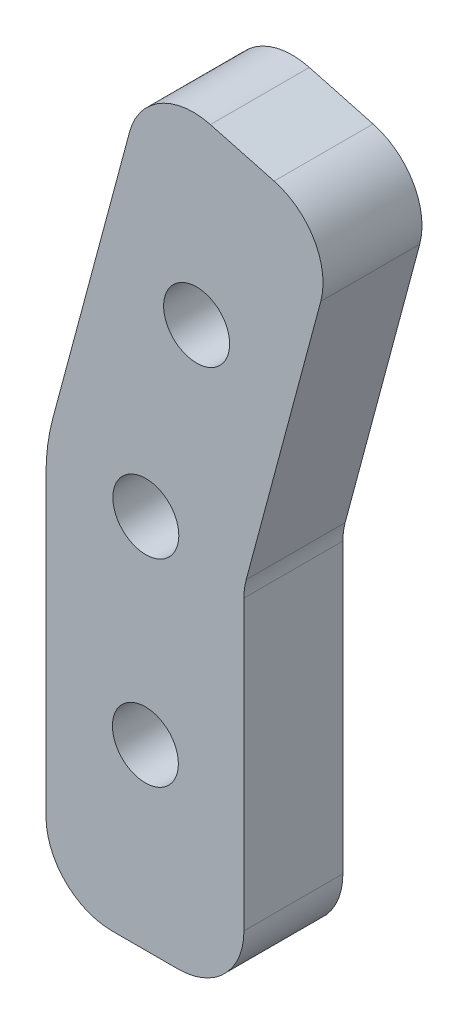
ISO-10303-21;
HEADER;
FILE_DESCRIPTION(('STEP AP214'),'2;1');
FILE_NAME('part.step','',(''),(''),'','','');
FILE_SCHEMA(('AUTOMOTIVE_DESIGN { 1 0 10303 214 1 1 1 1 }'));
ENDSEC;
DATA;
#1=APPLICATION_CONTEXT('core data for automotive mechanical design processes');
#2=APPLICATION_PROTOCOL_DEFINITION('international standard','automotive_design',2000,#1);
#3=PRODUCT_CONTEXT('',#1,'mechanical');
#4=PRODUCT('Part','Part','',(#3));
#5=PRODUCT_RELATED_PRODUCT_CATEGORY('part','',(#4));
#6=PRODUCT_DEFINITION_FORMATION('','',#4);
#7=PRODUCT_DEFINITION_CONTEXT('part definition',#1,'design');
#8=PRODUCT_DEFINITION('design','',#6,#7);
#9=PRODUCT_DEFINITION_SHAPE('','',#8);
#10=(LENGTH_UNIT() NAMED_UNIT(*) SI_UNIT(.MILLI.,.METRE.));
#11=(NAMED_UNIT(*) PLANE_ANGLE_UNIT() SI_UNIT($,.RADIAN.));
#12=(NAMED_UNIT(*) SI_UNIT($,.STERADIAN.) SOLID_ANGLE_UNIT());
#13=UNCERTAINTY_MEASURE_WITH_UNIT(LENGTH_MEASURE(1.E-05),#10,'distance_accuracy_value','');
#14=(GEOMETRIC_REPRESENTATION_CONTEXT(3) GLOBAL_UNCERTAINTY_ASSIGNED_CONTEXT((#13)) GLOBAL_UNIT_ASSIGNED_CONTEXT((#10,
#11,#12)) REPRESENTATION_CONTEXT('',''));
#15=CARTESIAN_POINT('',(0.,0.,0.));
#16=DIRECTION('',(0.,0.,1.));
#17=DIRECTION('',(1.,0.,0.));
#18=AXIS2_PLACEMENT_3D('',#15,#16,#17);
#19=CARTESIAN_POINT('',(9.525,-17.4625,4.7625));
#20=DIRECTION('',(-1.,0.,0.));
#21=DIRECTION('',(0.,0.,1.));
#22=AXIS2_PLACEMENT_3D('',#19,#20,#21);
#23=PLANE('',#22);
#24=DIRECTION('',(0.,1.,0.));
#25=VECTOR('',#24,1.);
#26=CARTESIAN_POINT('',(9.525,-17.4625,-4.7625));
#27=LINE('',#26,#25);
#28=CARTESIAN_POINT('',(9.525,-11.1125,-4.7625));
#29=VERTEX_POINT('',#28);
#30=CARTESIAN_POINT('',(9.525,16.62650664032,-4.7625));
#31=VERTEX_POINT('',#30);
#32=EDGE_CURVE('E142',#29,#31,#27,.T.);
#33=ORIENTED_EDGE('',*,*,#32,.T.);
#34=DIRECTION('',(0.,0.,-1.));
#35=VECTOR('',#34,1.);
#36=CARTESIAN_POINT('',(9.525,16.62650664032,4.7625));
#37=LINE('',#36,#35);
#38=CARTESIAN_POINT('',(9.525,16.62650664032,4.7625));
#39=VERTEX_POINT('',#38);
#40=EDGE_CURVE('E174',#31,#39,#37,.F.);
#41=ORIENTED_EDGE('',*,*,#40,.T.);
#42=DIRECTION('',(0.,1.,0.));
#43=VECTOR('',#42,1.);
#44=CARTESIAN_POINT('',(9.525,-17.4625,4.7625));
#45=LINE('',#44,#43);
#46=CARTESIAN_POINT('',(9.525,-11.1125,4.7625));
#47=VERTEX_POINT('',#46);
#48=EDGE_CURVE('E149',#47,#39,#45,.T.);
#49=ORIENTED_EDGE('',*,*,#48,.F.);
#50=DIRECTION('',(0.,0.,-1.));
#51=VECTOR('',#50,1.);
#52=CARTESIAN_POINT('',(9.525,-11.1125,4.7625));
#53=LINE('',#52,#51);
#54=EDGE_CURVE('E171',#47,#29,#53,.T.);
#55=ORIENTED_EDGE('',*,*,#54,.T.);
#56=EDGE_LOOP('',(#33,#41,#49,#55));
#57=FACE_BOUND('',#56,.T.);
#58=ADVANCED_FACE('F35',(#57),#23,.F.);
#59=CARTESIAN_POINT('',(-9.525,-17.4625,4.7625));
#60=DIRECTION('',(1.,0.,0.));
#61=DIRECTION('',(0.,0.,-1.));
#62=AXIS2_PLACEMENT_3D('',#59,#60,#61);
#63=PLANE('',#62);
#64=DIRECTION('',(0.,-1.,0.));
#65=VECTOR('',#64,1.);
#66=CARTESIAN_POINT('',(-9.525,-17.4625,-4.7625));
#67=LINE('',#66,#65);
#68=CARTESIAN_POINT('',(-9.525,17.4625,-4.7625));
#69=VERTEX_POINT('',#68);
#70=CARTESIAN_POINT('',(-9.525,-11.1125,-4.7625));
#71=VERTEX_POINT('',#70);
#72=EDGE_CURVE('E139',#69,#71,#67,.T.);
#73=ORIENTED_EDGE('',*,*,#72,.T.);
#74=DIRECTION('',(0.,0.,-1.));
#75=VECTOR('',#74,1.);
#76=CARTESIAN_POINT('',(-9.525,-11.1125,4.7625));
#77=LINE('',#76,#75);
#78=CARTESIAN_POINT('',(-9.525,-11.1125,4.7625));
#79=VERTEX_POINT('',#78);
#80=EDGE_CURVE('E201',#71,#79,#77,.F.);
#81=ORIENTED_EDGE('',*,*,#80,.T.);
#82=DIRECTION('',(0.,-1.,0.));
#83=VECTOR('',#82,1.);
#84=CARTESIAN_POINT('',(-9.525,-17.4625,4.7625));
#85=LINE('',#84,#83);
#86=CARTESIAN_POINT('',(-9.525,17.4625,4.7625));
#87=VERTEX_POINT('',#86);
#88=EDGE_CURVE('E152',#87,#79,#85,.T.);
#89=ORIENTED_EDGE('',*,*,#88,.F.);
#90=DIRECTION('',(0.,0.,-1.));
#91=VECTOR('',#90,1.);
#92=CARTESIAN_POINT('',(-9.525,17.4625,4.7625));
#93=LINE('',#92,#91);
#94=EDGE_CURVE('E159',#87,#69,#93,.T.);
#95=ORIENTED_EDGE('',*,*,#94,.T.);
#96=EDGE_LOOP('',(#73,#81,#89,#95));
#97=FACE_BOUND('',#96,.T.);
#98=ADVANCED_FACE('F283',(#97),#63,.F.);
#99=CARTESIAN_POINT('',(-9.525,-17.4625,4.7625));
#100=DIRECTION('',(0.,1.,0.));
#101=DIRECTION('',(0.,0.,1.));
#102=AXIS2_PLACEMENT_3D('',#99,#100,#101);
#103=PLANE('',#102);
#104=DIRECTION('',(1.,0.,0.));
#105=VECTOR('',#104,1.);
#106=CARTESIAN_POINT('',(-9.525,-17.4625,4.7625));
#107=LINE('',#106,#105);
#108=CARTESIAN_POINT('',(-3.175,-17.4625,4.7625));
#109=VERTEX_POINT('',#108);
#110=CARTESIAN_POINT('',(3.175,-17.4625,4.7625));
#111=VERTEX_POINT('',#110);
#112=EDGE_CURVE('E156',#109,#111,#107,.T.);
#113=ORIENTED_EDGE('',*,*,#112,.F.);
#114=DIRECTION('',(0.,0.,-1.));
#115=VECTOR('',#114,1.);
#116=CARTESIAN_POINT('',(-3.175,-17.4625,4.7625));
#117=LINE('',#116,#115);
#118=CARTESIAN_POINT('',(-3.175,-17.4625,-4.7625));
#119=VERTEX_POINT('',#118);
#120=EDGE_CURVE('E198',#109,#119,#117,.T.);
#121=ORIENTED_EDGE('',*,*,#120,.T.);
#122=DIRECTION('',(1.,0.,0.));
#123=VECTOR('',#122,1.);
#124=CARTESIAN_POINT('',(-9.525,-17.4625,-4.7625));
#125=LINE('',#124,#123);
#126=CARTESIAN_POINT('',(3.175,-17.4625,-4.7625));
#127=VERTEX_POINT('',#126);
#128=EDGE_CURVE('E153',#119,#127,#125,.T.);
#129=ORIENTED_EDGE('',*,*,#128,.T.);
#130=DIRECTION('',(0.,0.,-1.));
#131=VECTOR('',#130,1.);
#132=CARTESIAN_POINT('',(3.175,-17.4625,4.7625));
#133=LINE('',#132,#131);
#134=EDGE_CURVE('E196',#127,#111,#133,.F.);
#135=ORIENTED_EDGE('',*,*,#134,.T.);
#136=EDGE_LOOP('',(#113,#121,#129,#135));
#137=FACE_BOUND('',#136,.T.);
#138=ADVANCED_FACE('F263',(#137),#103,.F.);
#139=CARTESIAN_POINT('',(0.,0.,4.7625));
#140=DIRECTION('',(0.,0.,-1.));
#141=DIRECTION('',(-1.,0.,0.));
#142=AXIS2_PLACEMENT_3D('',#139,#140,#141);
#143=PLANE('',#142);
#144=CARTESIAN_POINT('',(0.0814876954144572,18.705761980896,4.7625));
#145=DIRECTION('',(0.,0.,1.));
#146=DIRECTION('',(1.,0.,0.));
#147=AXIS2_PLACEMENT_3D('',#144,#145,#146);
#148=CIRCLE('',#147,3.17499999999999);
#149=CARTESIAN_POINT('',(3.25648769541444,18.705761980896,4.7625));
#150=VERTEX_POINT('',#149);
#151=EDGE_CURVE('E255',#150,#150,#148,.T.);
#152=ORIENTED_EDGE('',*,*,#151,.F.);
#153=EDGE_LOOP('',(#152));
#154=FACE_BOUND('',#153,.T.);
#155=CARTESIAN_POINT('',(4.97052059182165,37.1177107462453,4.7625));
#156=DIRECTION('',(0.,0.,1.));
#157=DIRECTION('',(1.,0.,0.));
#158=AXIS2_PLACEMENT_3D('',#155,#156,#157);
#159=CIRCLE('',#158,3.17499999999999);
#160=CARTESIAN_POINT('',(8.14552059182164,37.1177107462453,4.7625));
#161=VERTEX_POINT('',#160);
#162=EDGE_CURVE('E249',#161,#161,#159,.T.);
#163=ORIENTED_EDGE('',*,*,#162,.F.);
#164=EDGE_LOOP('',(#163));
#165=FACE_BOUND('',#164,.T.);
#166=CARTESIAN_POINT('',(0.0385677287744967,-0.344238019104013,4.7625));
#167=DIRECTION('',(0.,0.,1.));
#168=DIRECTION('',(1.,0.,0.));
#169=AXIS2_PLACEMENT_3D('',#166,#167,#168);
#170=CIRCLE('',#169,3.17499999999999);
#171=CARTESIAN_POINT('',(3.21356772877448,-0.344238019104013,4.7625));
#172=VERTEX_POINT('',#171);
#173=EDGE_CURVE('E228',#172,#172,#170,.T.);
#174=ORIENTED_EDGE('',*,*,#173,.F.);
#175=EDGE_LOOP('',(#174));
#176=FACE_BOUND('',#175,.T.);
#177=DIRECTION('',(-0.965925826289068,0.258819045102521,0.));
#178=VECTOR('',#177,1.);
#179=CARTESIAN_POINT('',(18.5642551502056,51.1974594831457,4.7625));
#180=LINE('',#179,#178);
#181=CARTESIAN_POINT('',(12.43062615327,52.8409604195467,4.7625));
#182=VERTEX_POINT('',#181);
#183=CARTESIAN_POINT('',(6.29699715633439,54.4844613559477,4.7625));
#184=VERTEX_POINT('',#183);
#185=EDGE_CURVE('E222',#182,#184,#180,.T.);
#186=ORIENTED_EDGE('',*,*,#185,.T.);
#187=CARTESIAN_POINT('',(4.65349621993338,48.3508323590121,4.7625));
#188=DIRECTION('',(0.,0.,-1.));
#189=DIRECTION('',(-1.,0.,0.));
#190=AXIS2_PLACEMENT_3D('',#187,#188,#189);
#191=CIRCLE('',#190,6.35);
#192=CARTESIAN_POINT('',(-1.48013277700221,49.9943332954132,4.7625));
#193=VERTEX_POINT('',#192);
#194=EDGE_CURVE('E187',#184,#193,#191,.F.);
#195=ORIENTED_EDGE('',*,*,#194,.T.);
#196=DIRECTION('',(-0.258819045102521,-0.965925826289068,0.));
#197=VECTOR('',#196,1.);
#198=CARTESIAN_POINT('',(0.163368159398802,56.1279622923487,4.7625));
#199=LINE('',#198,#197);
#200=CARTESIAN_POINT('',(-8.87588699080675,22.393002809203,4.7625));
#201=VERTEX_POINT('',#200);
#202=EDGE_CURVE('E225',#193,#201,#199,.T.);
#203=ORIENTED_EDGE('',*,*,#202,.T.);
#204=CARTESIAN_POINT('',(9.525,17.4625,4.7625));
#205=DIRECTION('',(0.,0.,1.));
#206=DIRECTION('',(1.,0.,0.));
#207=AXIS2_PLACEMENT_3D('',#204,#205,#206);
#208=CIRCLE('',#207,19.05);
#209=EDGE_CURVE('E133',#201,#87,#208,.T.);
#210=ORIENTED_EDGE('',*,*,#209,.T.);
#211=ORIENTED_EDGE('',*,*,#88,.T.);
#212=CARTESIAN_POINT('',(-3.175,-11.1125,4.7625));
#213=DIRECTION('',(0.,0.,-1.));
#214=DIRECTION('',(-1.,0.,0.));
#215=AXIS2_PLACEMENT_3D('',#212,#213,#214);
#216=CIRCLE('',#215,6.35);
#217=EDGE_CURVE('E185',#79,#109,#216,.F.);
#218=ORIENTED_EDGE('',*,*,#217,.T.);
#219=ORIENTED_EDGE('',*,*,#112,.T.);
#220=CARTESIAN_POINT('',(3.175,-11.1125,4.7625));
#221=DIRECTION('',(0.,0.,-1.));
#222=DIRECTION('',(-1.,0.,0.));
#223=AXIS2_PLACEMENT_3D('',#220,#221,#222);
#224=CIRCLE('',#223,6.35);
#225=EDGE_CURVE('E183',#111,#47,#224,.F.);
#226=ORIENTED_EDGE('',*,*,#225,.T.);
#227=ORIENTED_EDGE('',*,*,#48,.T.);
#228=CARTESIAN_POINT('',(15.875,16.62650664032,4.7625));
#229=DIRECTION('',(0.,0.,-1.));
#230=DIRECTION('',(-1.,0.,0.));
#231=AXIS2_PLACEMENT_3D('',#228,#229,#230);
#232=CIRCLE('',#231,6.35);
#233=CARTESIAN_POINT('',(9.74137100306442,18.270007576721,4.7625));
#234=VERTEX_POINT('',#233);
#235=EDGE_CURVE('E11',#39,#234,#232,.T.);
#236=ORIENTED_EDGE('',*,*,#235,.T.);
#237=DIRECTION('',(0.258819045102521,0.965925826289068,0.));
#238=VECTOR('',#237,1.);
#239=CARTESIAN_POINT('',(9.525,17.4625,4.7625));
#240=LINE('',#239,#238);
#241=CARTESIAN_POINT('',(16.9207542138045,45.0638304862101,4.7625));
#242=VERTEX_POINT('',#241);
#243=EDGE_CURVE('E218',#234,#242,#240,.T.);
#244=ORIENTED_EDGE('',*,*,#243,.T.);
#245=CARTESIAN_POINT('',(10.787125216869,46.7073314226111,4.7625));
#246=DIRECTION('',(0.,0.,-1.));
#247=DIRECTION('',(-1.,0.,0.));
#248=AXIS2_PLACEMENT_3D('',#245,#246,#247);
#249=CIRCLE('',#248,6.35);
#250=EDGE_CURVE('E181',#242,#182,#249,.F.);
#251=ORIENTED_EDGE('',*,*,#250,.T.);
#252=EDGE_LOOP('',(#186,#195,#203,#210,#211,#218,#219,#226,#227,#236,#244,#251));
#253=FACE_BOUND('',#252,.T.);
#254=ADVANCED_FACE('F217',(#154,#165,#176,#253),#143,.F.);
#255=CARTESIAN_POINT('',(0.,0.,-4.7625));
#256=DIRECTION('',(0.,0.,-1.));
#257=DIRECTION('',(-1.,0.,0.));
#258=AXIS2_PLACEMENT_3D('',#255,#256,#257);
#259=PLANE('',#258);
#260=CARTESIAN_POINT('',(0.0814876954144572,18.705761980896,-4.7625));
#261=DIRECTION('',(0.,0.,1.));
#262=DIRECTION('',(1.,0.,0.));
#263=AXIS2_PLACEMENT_3D('',#260,#261,#262);
#264=CIRCLE('',#263,3.175);
#265=CARTESIAN_POINT('',(3.25648769541445,18.705761980896,-4.7625));
#266=VERTEX_POINT('',#265);
#267=EDGE_CURVE('E252',#266,#266,#264,.T.);
#268=ORIENTED_EDGE('',*,*,#267,.T.);
#269=EDGE_LOOP('',(#268));
#270=FACE_BOUND('',#269,.T.);
#271=CARTESIAN_POINT('',(4.97052059182165,37.1177107462453,-4.7625));
#272=DIRECTION('',(0.,0.,1.));
#273=DIRECTION('',(1.,0.,0.));
#274=AXIS2_PLACEMENT_3D('',#271,#272,#273);
#275=CIRCLE('',#274,3.175);
#276=CARTESIAN_POINT('',(8.14552059182165,37.1177107462453,-4.7625));
#277=VERTEX_POINT('',#276);
#278=EDGE_CURVE('E246',#277,#277,#275,.T.);
#279=ORIENTED_EDGE('',*,*,#278,.T.);
#280=EDGE_LOOP('',(#279));
#281=FACE_BOUND('',#280,.T.);
#282=CARTESIAN_POINT('',(0.0385677287744967,-0.344238019104013,-4.7625));
#283=DIRECTION('',(0.,0.,1.));
#284=DIRECTION('',(1.,0.,0.));
#285=AXIS2_PLACEMENT_3D('',#282,#283,#284);
#286=CIRCLE('',#285,3.175);
#287=CARTESIAN_POINT('',(3.21356772877449,-0.344238019104013,-4.7625));
#288=VERTEX_POINT('',#287);
#289=EDGE_CURVE('E223',#288,#288,#286,.T.);
#290=ORIENTED_EDGE('',*,*,#289,.T.);
#291=EDGE_LOOP('',(#290));
#292=FACE_BOUND('',#291,.T.);
#293=DIRECTION('',(-0.258819045102521,-0.965925826289068,0.));
#294=VECTOR('',#293,1.);
#295=CARTESIAN_POINT('',(0.163368159398802,56.1279622923487,-4.7625));
#296=LINE('',#295,#294);
#297=CARTESIAN_POINT('',(-1.48013277700221,49.9943332954132,-4.7625));
#298=VERTEX_POINT('',#297);
#299=CARTESIAN_POINT('',(-8.87588699080675,22.393002809203,-4.7625));
#300=VERTEX_POINT('',#299);
#301=EDGE_CURVE('E123',#298,#300,#296,.T.);
#302=ORIENTED_EDGE('',*,*,#301,.F.);
#303=CARTESIAN_POINT('',(4.65349621993338,48.3508323590121,-4.7625));
#304=DIRECTION('',(0.,0.,-1.));
#305=DIRECTION('',(-1.,0.,0.));
#306=AXIS2_PLACEMENT_3D('',#303,#304,#305);
#307=CIRCLE('',#306,6.35);
#308=CARTESIAN_POINT('',(6.29699715633438,54.4844613559477,-4.7625));
#309=VERTEX_POINT('',#308);
#310=EDGE_CURVE('E194',#298,#309,#307,.T.);
#311=ORIENTED_EDGE('',*,*,#310,.T.);
#312=DIRECTION('',(-0.965925826289068,0.258819045102521,0.));
#313=VECTOR('',#312,1.);
#314=CARTESIAN_POINT('',(18.5642551502056,51.1974594831457,-4.7625));
#315=LINE('',#314,#313);
#316=CARTESIAN_POINT('',(12.43062615327,52.8409604195467,-4.7625));
#317=VERTEX_POINT('',#316);
#318=EDGE_CURVE('E134',#317,#309,#315,.T.);
#319=ORIENTED_EDGE('',*,*,#318,.F.);
#320=CARTESIAN_POINT('',(10.787125216869,46.7073314226111,-4.7625));
#321=DIRECTION('',(0.,0.,-1.));
#322=DIRECTION('',(-1.,0.,0.));
#323=AXIS2_PLACEMENT_3D('',#320,#321,#322);
#324=CIRCLE('',#323,6.35);
#325=CARTESIAN_POINT('',(16.9207542138045,45.0638304862101,-4.7625));
#326=VERTEX_POINT('',#325);
#327=EDGE_CURVE('E190',#317,#326,#324,.T.);
#328=ORIENTED_EDGE('',*,*,#327,.T.);
#329=DIRECTION('',(0.258819045102521,0.965925826289068,0.));
#330=VECTOR('',#329,1.);
#331=CARTESIAN_POINT('',(9.525,17.4625,-4.7625));
#332=LINE('',#331,#330);
#333=CARTESIAN_POINT('',(9.74137100306442,18.270007576721,-4.7625));
#334=VERTEX_POINT('',#333);
#335=EDGE_CURVE('E204',#334,#326,#332,.T.);
#336=ORIENTED_EDGE('',*,*,#335,.F.);
#337=CARTESIAN_POINT('',(15.875,16.62650664032,-4.7625));
#338=DIRECTION('',(0.,0.,-1.));
#339=DIRECTION('',(-1.,0.,0.));
#340=AXIS2_PLACEMENT_3D('',#337,#338,#339);
#341=CIRCLE('',#340,6.35);
#342=EDGE_CURVE('E43',#334,#31,#341,.F.);
#343=ORIENTED_EDGE('',*,*,#342,.T.);
#344=ORIENTED_EDGE('',*,*,#32,.F.);
#345=CARTESIAN_POINT('',(3.175,-11.1125,-4.7625));
#346=DIRECTION('',(0.,0.,-1.));
#347=DIRECTION('',(-1.,0.,0.));
#348=AXIS2_PLACEMENT_3D('',#345,#346,#347);
#349=CIRCLE('',#348,6.35);
#350=EDGE_CURVE('E56',#29,#127,#349,.T.);
#351=ORIENTED_EDGE('',*,*,#350,.T.);
#352=ORIENTED_EDGE('',*,*,#128,.F.);
#353=CARTESIAN_POINT('',(-3.175,-11.1125,-4.7625));
#354=DIRECTION('',(0.,0.,-1.));
#355=DIRECTION('',(-1.,0.,0.));
#356=AXIS2_PLACEMENT_3D('',#353,#354,#355);
#357=CIRCLE('',#356,6.35);
#358=EDGE_CURVE('E50',#119,#71,#357,.T.);
#359=ORIENTED_EDGE('',*,*,#358,.T.);
#360=ORIENTED_EDGE('',*,*,#72,.F.);
#361=CARTESIAN_POINT('',(9.525,17.4625,-4.7625));
#362=DIRECTION('',(0.,0.,-1.));
#363=DIRECTION('',(-1.,0.,0.));
#364=AXIS2_PLACEMENT_3D('',#361,#362,#363);
#365=CIRCLE('',#364,19.05);
#366=EDGE_CURVE('E137',#300,#69,#365,.F.);
#367=ORIENTED_EDGE('',*,*,#366,.F.);
#368=EDGE_LOOP('',(#302,#311,#319,#328,#336,#343,#344,#351,#352,#359,#360,#367));
#369=FACE_BOUND('',#368,.T.);
#370=ADVANCED_FACE('F138',(#270,#281,#292,#369),#259,.T.);
#371=CARTESIAN_POINT('',(9.525,17.4625,-24.4402122133534));
#372=DIRECTION('',(0.,0.,1.));
#373=DIRECTION('',(1.,0.,0.));
#374=AXIS2_PLACEMENT_3D('',#371,#372,#373);
#375=CYLINDRICAL_SURFACE('',#374,19.05);
#376=DIRECTION('',(0.,0.,1.));
#377=VECTOR('',#376,1.);
#378=CARTESIAN_POINT('',(-8.87588699080675,22.393002809203,-24.4402122133534));
#379=LINE('',#378,#377);
#380=EDGE_CURVE('E128',#300,#201,#379,.T.);
#381=ORIENTED_EDGE('',*,*,#380,.F.);
#382=ORIENTED_EDGE('',*,*,#366,.T.);
#383=ORIENTED_EDGE('',*,*,#94,.F.);
#384=ORIENTED_EDGE('',*,*,#209,.F.);
#385=EDGE_LOOP('',(#381,#382,#383,#384));
#386=FACE_BOUND('',#385,.T.);
#387=ADVANCED_FACE('F144',(#386),#375,.T.);
#388=CARTESIAN_POINT('',(9.525,17.4625,-52.1753608607412));
#389=DIRECTION('',(0.965925826289068,-0.258819045102521,0.));
#390=DIRECTION('',(0.258819045102521,0.965925826289068,0.));
#391=AXIS2_PLACEMENT_3D('',#388,#389,#390);
#392=PLANE('',#391);
#393=ORIENTED_EDGE('',*,*,#243,.F.);
#394=DIRECTION('',(0.,0.,-1.));
#395=VECTOR('',#394,1.);
#396=CARTESIAN_POINT('',(9.74137100306442,18.270007576721,-52.1753608607412));
#397=LINE('',#396,#395);
#398=EDGE_CURVE('E168',#234,#334,#397,.T.);
#399=ORIENTED_EDGE('',*,*,#398,.T.);
#400=ORIENTED_EDGE('',*,*,#335,.T.);
#401=DIRECTION('',(0.,0.,1.));
#402=VECTOR('',#401,1.);
#403=CARTESIAN_POINT('',(16.9207542138045,45.0638304862101,-52.1753608607412));
#404=LINE('',#403,#402);
#405=EDGE_CURVE('E165',#326,#242,#404,.T.);
#406=ORIENTED_EDGE('',*,*,#405,.T.);
#407=EDGE_LOOP('',(#393,#399,#400,#406));
#408=FACE_BOUND('',#407,.T.);
#409=ADVANCED_FACE('F220',(#408),#392,.T.);
#410=CARTESIAN_POINT('',(18.5642551502056,51.1974594831457,-52.1753608607412));
#411=DIRECTION('',(0.258819045102521,0.965925826289068,0.));
#412=DIRECTION('',(-0.965925826289068,0.258819045102521,0.));
#413=AXIS2_PLACEMENT_3D('',#410,#411,#412);
#414=PLANE('',#413);
#415=ORIENTED_EDGE('',*,*,#318,.T.);
#416=DIRECTION('',(0.,0.,1.));
#417=VECTOR('',#416,1.);
#418=CARTESIAN_POINT('',(6.29699715633439,54.4844613559477,-52.1753608607412));
#419=LINE('',#418,#417);
#420=EDGE_CURVE('E178',#309,#184,#419,.T.);
#421=ORIENTED_EDGE('',*,*,#420,.T.);
#422=ORIENTED_EDGE('',*,*,#185,.F.);
#423=DIRECTION('',(0.,0.,1.));
#424=VECTOR('',#423,1.);
#425=CARTESIAN_POINT('',(12.43062615327,52.8409604195467,-52.1753608607412));
#426=LINE('',#425,#424);
#427=EDGE_CURVE('E176',#182,#317,#426,.F.);
#428=ORIENTED_EDGE('',*,*,#427,.T.);
#429=EDGE_LOOP('',(#415,#421,#422,#428));
#430=FACE_BOUND('',#429,.T.);
#431=ADVANCED_FACE('F237',(#430),#414,.T.);
#432=CARTESIAN_POINT('',(0.163368159398802,56.1279622923487,-52.1753608607412));
#433=DIRECTION('',(-0.965925826289068,0.258819045102521,0.));
#434=DIRECTION('',(-0.258819045102521,-0.965925826289068,0.));
#435=AXIS2_PLACEMENT_3D('',#432,#433,#434);
#436=PLANE('',#435);
#437=ORIENTED_EDGE('',*,*,#202,.F.);
#438=DIRECTION('',(0.,0.,1.));
#439=VECTOR('',#438,1.);
#440=CARTESIAN_POINT('',(-1.48013277700221,49.9943332954132,-52.1753608607412));
#441=LINE('',#440,#439);
#442=EDGE_CURVE('E131',#193,#298,#441,.F.);
#443=ORIENTED_EDGE('',*,*,#442,.T.);
#444=ORIENTED_EDGE('',*,*,#301,.T.);
#445=ORIENTED_EDGE('',*,*,#380,.T.);
#446=EDGE_LOOP('',(#437,#443,#444,#445));
#447=FACE_BOUND('',#446,.T.);
#448=ADVANCED_FACE('F126',(#447),#436,.T.);
#449=CARTESIAN_POINT('',(0.0385677287744967,-0.344238019104013,4.7625));
#450=DIRECTION('',(0.,0.,1.));
#451=DIRECTION('',(1.,0.,0.));
#452=AXIS2_PLACEMENT_3D('',#449,#450,#451);
#453=CYLINDRICAL_SURFACE('',#452,3.17499999999999);
#454=ORIENTED_EDGE('',*,*,#289,.F.);
#455=EDGE_LOOP('',(#454));
#456=FACE_BOUND('',#455,.T.);
#457=ORIENTED_EDGE('',*,*,#173,.T.);
#458=EDGE_LOOP('',(#457));
#459=FACE_BOUND('',#458,.T.);
#460=ADVANCED_FACE('F269',(#456,#459),#453,.F.);
#461=CARTESIAN_POINT('',(4.97052059182165,37.1177107462453,4.7625));
#462=DIRECTION('',(0.,0.,1.));
#463=DIRECTION('',(1.,0.,0.));
#464=AXIS2_PLACEMENT_3D('',#461,#462,#463);
#465=CYLINDRICAL_SURFACE('',#464,3.17499999999999);
#466=ORIENTED_EDGE('',*,*,#278,.F.);
#467=EDGE_LOOP('',(#466));
#468=FACE_BOUND('',#467,.T.);
#469=ORIENTED_EDGE('',*,*,#162,.T.);
#470=EDGE_LOOP('',(#469));
#471=FACE_BOUND('',#470,.T.);
#472=ADVANCED_FACE('F271',(#468,#471),#465,.F.);
#473=CARTESIAN_POINT('',(0.0814876954144572,18.705761980896,4.7625));
#474=DIRECTION('',(0.,0.,1.));
#475=DIRECTION('',(1.,0.,0.));
#476=AXIS2_PLACEMENT_3D('',#473,#474,#475);
#477=CYLINDRICAL_SURFACE('',#476,3.17499999999999);
#478=ORIENTED_EDGE('',*,*,#267,.F.);
#479=EDGE_LOOP('',(#478));
#480=FACE_BOUND('',#479,.T.);
#481=ORIENTED_EDGE('',*,*,#151,.T.);
#482=EDGE_LOOP('',(#481));
#483=FACE_BOUND('',#482,.T.);
#484=ADVANCED_FACE('F259',(#480,#483),#477,.F.);
#485=CARTESIAN_POINT('',(15.875,16.62650664032,-52.1753608607412));
#486=DIRECTION('',(0.,0.,-1.));
#487=DIRECTION('',(-1.,0.,0.));
#488=AXIS2_PLACEMENT_3D('',#485,#486,#487);
#489=CYLINDRICAL_SURFACE('',#488,6.35);
#490=ORIENTED_EDGE('',*,*,#235,.F.);
#491=ORIENTED_EDGE('',*,*,#40,.F.);
#492=ORIENTED_EDGE('',*,*,#342,.F.);
#493=ORIENTED_EDGE('',*,*,#398,.F.);
#494=EDGE_LOOP('',(#490,#491,#492,#493));
#495=FACE_BOUND('',#494,.T.);
#496=ADVANCED_FACE('F212',(#495),#489,.F.);
#497=CARTESIAN_POINT('',(4.65349621993338,48.3508323590121,-52.1753608607412));
#498=DIRECTION('',(0.,0.,1.));
#499=DIRECTION('',(1.,0.,0.));
#500=AXIS2_PLACEMENT_3D('',#497,#498,#499);
#501=CYLINDRICAL_SURFACE('',#500,6.35);
#502=ORIENTED_EDGE('',*,*,#310,.F.);
#503=ORIENTED_EDGE('',*,*,#442,.F.);
#504=ORIENTED_EDGE('',*,*,#194,.F.);
#505=ORIENTED_EDGE('',*,*,#420,.F.);
#506=EDGE_LOOP('',(#502,#503,#504,#505));
#507=FACE_BOUND('',#506,.T.);
#508=ADVANCED_FACE('F242',(#507),#501,.T.);
#509=CARTESIAN_POINT('',(-3.175,-11.1125,4.7625));
#510=DIRECTION('',(0.,0.,-1.));
#511=DIRECTION('',(-1.,0.,0.));
#512=AXIS2_PLACEMENT_3D('',#509,#510,#511);
#513=CYLINDRICAL_SURFACE('',#512,6.35);
#514=ORIENTED_EDGE('',*,*,#217,.F.);
#515=ORIENTED_EDGE('',*,*,#80,.F.);
#516=ORIENTED_EDGE('',*,*,#358,.F.);
#517=ORIENTED_EDGE('',*,*,#120,.F.);
#518=EDGE_LOOP('',(#514,#515,#516,#517));
#519=FACE_BOUND('',#518,.T.);
#520=ADVANCED_FACE('F296',(#519),#513,.T.);
#521=CARTESIAN_POINT('',(3.175,-11.1125,4.7625));
#522=DIRECTION('',(0.,0.,-1.));
#523=DIRECTION('',(-1.,0.,0.));
#524=AXIS2_PLACEMENT_3D('',#521,#522,#523);
#525=CYLINDRICAL_SURFACE('',#524,6.35);
#526=ORIENTED_EDGE('',*,*,#225,.F.);
#527=ORIENTED_EDGE('',*,*,#134,.F.);
#528=ORIENTED_EDGE('',*,*,#350,.F.);
#529=ORIENTED_EDGE('',*,*,#54,.F.);
#530=EDGE_LOOP('',(#526,#527,#528,#529));
#531=FACE_BOUND('',#530,.T.);
#532=ADVANCED_FACE('F298',(#531),#525,.T.);
#533=CARTESIAN_POINT('',(10.787125216869,46.7073314226111,-52.1753608607412));
#534=DIRECTION('',(0.,0.,1.));
#535=DIRECTION('',(1.,0.,0.));
#536=AXIS2_PLACEMENT_3D('',#533,#534,#535);
#537=CYLINDRICAL_SURFACE('',#536,6.35);
#538=ORIENTED_EDGE('',*,*,#327,.F.);
#539=ORIENTED_EDGE('',*,*,#427,.F.);
#540=ORIENTED_EDGE('',*,*,#250,.F.);
#541=ORIENTED_EDGE('',*,*,#405,.F.);
#542=EDGE_LOOP('',(#538,#539,#540,#541));
#543=FACE_BOUND('',#542,.T.);
#544=ADVANCED_FACE('F37',(#543),#537,.T.);
#545=CLOSED_SHELL('',(#58,#98,#138,#254,#370,#387,#409,#431,#448,#460,#472,#484,#496,#508,#520,
#532,#544));
#546=MANIFOLD_SOLID_BREP('B2',#545);
#547=ADVANCED_BREP_SHAPE_REPRESENTATION('',(#18,#546),#14);
#548=SHAPE_DEFINITION_REPRESENTATION(#9,#547);
ENDSEC;
END-ISO-10303-21;
